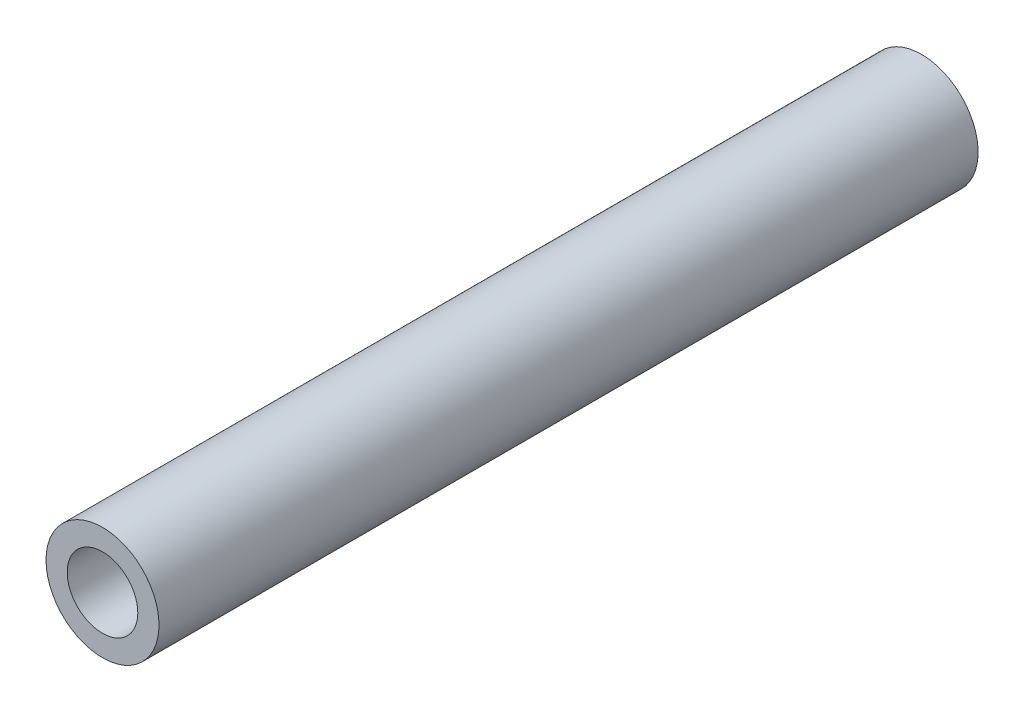
ISO-10303-21;
HEADER;
FILE_DESCRIPTION(('STEP AP214'),'2;1');
FILE_NAME('part.step','',(''),(''),'','','');
FILE_SCHEMA(('AUTOMOTIVE_DESIGN { 1 0 10303 214 1 1 1 1 }'));
ENDSEC;
DATA;
#1=APPLICATION_CONTEXT('core data for automotive mechanical design processes');
#2=APPLICATION_PROTOCOL_DEFINITION('international standard','automotive_design',2000,#1);
#3=PRODUCT_CONTEXT('',#1,'mechanical');
#4=PRODUCT('Part','Part','',(#3));
#5=PRODUCT_RELATED_PRODUCT_CATEGORY('part','',(#4));
#6=PRODUCT_DEFINITION_FORMATION('','',#4);
#7=PRODUCT_DEFINITION_CONTEXT('part definition',#1,'design');
#8=PRODUCT_DEFINITION('design','',#6,#7);
#9=PRODUCT_DEFINITION_SHAPE('','',#8);
#10=(LENGTH_UNIT() NAMED_UNIT(*) SI_UNIT(.MILLI.,.METRE.));
#11=(NAMED_UNIT(*) PLANE_ANGLE_UNIT() SI_UNIT($,.RADIAN.));
#12=(NAMED_UNIT(*) SI_UNIT($,.STERADIAN.) SOLID_ANGLE_UNIT());
#13=UNCERTAINTY_MEASURE_WITH_UNIT(LENGTH_MEASURE(1.E-05),#10,'distance_accuracy_value','');
#14=(GEOMETRIC_REPRESENTATION_CONTEXT(3) GLOBAL_UNCERTAINTY_ASSIGNED_CONTEXT((#13)) GLOBAL_UNIT_ASSIGNED_CONTEXT((#10,
#11,#12)) REPRESENTATION_CONTEXT('',''));
#15=CARTESIAN_POINT('',(0.,0.,0.));
#16=DIRECTION('',(0.,0.,1.));
#17=DIRECTION('',(1.,0.,0.));
#18=AXIS2_PLACEMENT_3D('',#15,#16,#17);
#19=CARTESIAN_POINT('',(0.,0.,29.));
#20=DIRECTION('',(0.,0.,-1.));
#21=DIRECTION('',(-1.,0.,0.));
#22=AXIS2_PLACEMENT_3D('',#19,#20,#21);
#23=CYLINDRICAL_SURFACE('',#22,2.);
#24=CARTESIAN_POINT('',(0.,0.,29.));
#25=DIRECTION('',(0.,0.,1.));
#26=DIRECTION('',(1.,0.,0.));
#27=AXIS2_PLACEMENT_3D('',#24,#25,#26);
#28=CIRCLE('',#27,2.);
#29=CARTESIAN_POINT('',(-2.,0.,29.));
#30=VERTEX_POINT('',#29);
#31=EDGE_CURVE('E11',#30,#30,#28,.T.);
#32=CARTESIAN_POINT('',(0.,0.,0.));
#33=DIRECTION('',(0.,0.,1.));
#34=DIRECTION('',(1.,0.,0.));
#35=AXIS2_PLACEMENT_3D('',#32,#33,#34);
#36=CIRCLE('',#35,2.);
#37=CARTESIAN_POINT('',(-2.,0.,0.));
#38=VERTEX_POINT('',#37);
#39=EDGE_CURVE('E36',#38,#38,#36,.T.);
#40=CARTESIAN_POINT('',(-2.,0.,29.));
#41=CARTESIAN_POINT('',(-2.,0.,28.6979166666667));
#42=CARTESIAN_POINT('',(-2.,0.,28.3958333333333));
#43=CARTESIAN_POINT('',(-2.,0.,27.7916666666667));
#44=CARTESIAN_POINT('',(-2.,0.,27.4895833333333));
#45=CARTESIAN_POINT('',(-2.,0.,26.8854166666667));
#46=CARTESIAN_POINT('',(-2.,0.,26.5833333333333));
#47=CARTESIAN_POINT('',(-2.,0.,25.9791666666667));
#48=CARTESIAN_POINT('',(-2.,0.,25.6770833333333));
#49=CARTESIAN_POINT('',(-2.,0.,25.0729166666667));
#50=CARTESIAN_POINT('',(-2.,0.,24.7708333333333));
#51=CARTESIAN_POINT('',(-2.,0.,24.1666666666667));
#52=CARTESIAN_POINT('',(-2.,0.,23.8645833333333));
#53=CARTESIAN_POINT('',(-2.,0.,23.2604166666667));
#54=CARTESIAN_POINT('',(-2.,0.,22.9583333333333));
#55=CARTESIAN_POINT('',(-2.,0.,22.3541666666667));
#56=CARTESIAN_POINT('',(-2.,0.,22.0520833333333));
#57=CARTESIAN_POINT('',(-2.,0.,21.4479166666667));
#58=CARTESIAN_POINT('',(-2.,0.,21.1458333333333));
#59=CARTESIAN_POINT('',(-2.,0.,20.5416666666667));
#60=CARTESIAN_POINT('',(-2.,0.,20.2395833333333));
#61=CARTESIAN_POINT('',(-2.,0.,19.6354166666667));
#62=CARTESIAN_POINT('',(-2.,0.,19.3333333333333));
#63=CARTESIAN_POINT('',(-2.,0.,18.7291666666667));
#64=CARTESIAN_POINT('',(-2.,0.,18.4270833333333));
#65=CARTESIAN_POINT('',(-2.,0.,17.8229166666667));
#66=CARTESIAN_POINT('',(-2.,0.,17.5208333333333));
#67=CARTESIAN_POINT('',(-2.,0.,16.9166666666667));
#68=CARTESIAN_POINT('',(-2.,0.,16.6145833333333));
#69=CARTESIAN_POINT('',(-2.,0.,16.0104166666667));
#70=CARTESIAN_POINT('',(-2.,0.,15.7083333333333));
#71=CARTESIAN_POINT('',(-2.,0.,15.1041666666667));
#72=CARTESIAN_POINT('',(-2.,0.,14.8020833333333));
#73=CARTESIAN_POINT('',(-2.,0.,14.1979166666667));
#74=CARTESIAN_POINT('',(-2.,0.,13.8958333333333));
#75=CARTESIAN_POINT('',(-2.,0.,13.2916666666667));
#76=CARTESIAN_POINT('',(-2.,0.,12.9895833333333));
#77=CARTESIAN_POINT('',(-2.,0.,12.3854166666667));
#78=CARTESIAN_POINT('',(-2.,0.,12.0833333333333));
#79=CARTESIAN_POINT('',(-2.,0.,11.4791666666667));
#80=CARTESIAN_POINT('',(-2.,0.,11.1770833333333));
#81=CARTESIAN_POINT('',(-2.,0.,10.5729166666667));
#82=CARTESIAN_POINT('',(-2.,0.,10.2708333333333));
#83=CARTESIAN_POINT('',(-2.,0.,9.66666666666667));
#84=CARTESIAN_POINT('',(-2.,0.,9.36458333333333));
#85=CARTESIAN_POINT('',(-2.,0.,8.76041666666667));
#86=CARTESIAN_POINT('',(-2.,0.,8.45833333333333));
#87=CARTESIAN_POINT('',(-2.,0.,7.85416666666667));
#88=CARTESIAN_POINT('',(-2.,0.,7.55208333333333));
#89=CARTESIAN_POINT('',(-2.,0.,6.94791666666667));
#90=CARTESIAN_POINT('',(-2.,0.,6.64583333333333));
#91=CARTESIAN_POINT('',(-2.,0.,6.04166666666667));
#92=CARTESIAN_POINT('',(-2.,0.,5.73958333333333));
#93=CARTESIAN_POINT('',(-2.,0.,5.13541666666667));
#94=CARTESIAN_POINT('',(-2.,0.,4.83333333333333));
#95=CARTESIAN_POINT('',(-2.,0.,4.22916666666667));
#96=CARTESIAN_POINT('',(-2.,0.,3.92708333333333));
#97=CARTESIAN_POINT('',(-2.,0.,3.32291666666667));
#98=CARTESIAN_POINT('',(-2.,0.,3.02083333333333));
#99=CARTESIAN_POINT('',(-2.,0.,2.41666666666667));
#100=CARTESIAN_POINT('',(-2.,0.,2.11458333333333));
#101=CARTESIAN_POINT('',(-2.,0.,1.51041666666667));
#102=CARTESIAN_POINT('',(-2.,0.,1.20833333333333));
#103=CARTESIAN_POINT('',(-2.,0.,0.604166666666667));
#104=CARTESIAN_POINT('',(-2.,0.,0.302083333333333));
#105=CARTESIAN_POINT('',(-2.,0.,0.));
#106=B_SPLINE_CURVE_WITH_KNOTS('',3,(#40,#41,#42,#43,#44,#45,#46,#47,#48,#49,#50,#51,#52,#53,
#54,#55,#56,#57,#58,#59,#60,#61,#62,#63,#64,#65,#66,#67,#68,#69,#70,#71,#72,#73,#74,#75,#76,#77,
#78,#79,#80,#81,#82,#83,#84,#85,#86,#87,#88,#89,#90,#91,#92,#93,#94,#95,#96,#97,#98,#99,#100,
#101,#102,#103,#104,#105),.UNSPECIFIED.,.F.,.F.,(4,2,2,2,2,2,2,2,2,2,2,2,2,2,2,2,2,2,2,2,2,2,2,
2,2,2,2,2,2,2,2,2,4),(0.,0.906249999999997,1.8125,2.71875,3.625,4.53125,5.4375,6.34375,7.25,
8.15625,9.0625,9.96875,10.875,11.78125,12.6875,13.59375,14.5,15.40625,16.3125,17.21875,18.125,
19.03125,19.9375,20.84375,21.75,22.65625,23.5625,24.46875,25.375,26.28125,27.1875,28.09375,29.),.UNSPECIFIED.);
#107=EDGE_CURVE('BSEAM33',#30,#38,#106,.T.);
#108=ORIENTED_EDGE('',*,*,#31,.F.);
#109=ORIENTED_EDGE('',*,*,#39,.T.);
#110=ORIENTED_EDGE('',*,*,#107,.T.);
#111=ORIENTED_EDGE('',*,*,#107,.F.);
#112=EDGE_LOOP('',(#108,#110,#109,#111));
#113=FACE_BOUND('',#112,.T.);
#114=ADVANCED_FACE('F33',(#113),#23,.T.);
#115=CARTESIAN_POINT('',(0.,0.,29.));
#116=DIRECTION('',(0.,0.,1.));
#117=DIRECTION('',(1.,0.,0.));
#118=AXIS2_PLACEMENT_3D('',#115,#116,#117);
#119=PLANE('',#118);
#120=CARTESIAN_POINT('',(0.,0.,29.));
#121=DIRECTION('',(0.,0.,1.));
#122=DIRECTION('',(1.,0.,0.));
#123=AXIS2_PLACEMENT_3D('',#120,#121,#122);
#124=CIRCLE('',#123,1.25);
#125=CARTESIAN_POINT('',(1.25,0.,29.));
#126=VERTEX_POINT('',#125);
#127=EDGE_CURVE('E56',#126,#126,#124,.T.);
#128=ORIENTED_EDGE('',*,*,#127,.F.);
#129=EDGE_LOOP('',(#128));
#130=FACE_BOUND('',#129,.T.);
#131=ORIENTED_EDGE('',*,*,#31,.T.);
#132=EDGE_LOOP('',(#131));
#133=FACE_BOUND('',#132,.T.);
#134=ADVANCED_FACE('F75',(#130,#133),#119,.T.);
#135=CARTESIAN_POINT('',(0.,0.,0.));
#136=DIRECTION('',(0.,0.,1.));
#137=DIRECTION('',(1.,0.,0.));
#138=AXIS2_PLACEMENT_3D('',#135,#136,#137);
#139=PLANE('',#138);
#140=CARTESIAN_POINT('',(0.,0.,0.));
#141=DIRECTION('',(0.,0.,-1.));
#142=DIRECTION('',(-1.,0.,0.));
#143=AXIS2_PLACEMENT_3D('',#140,#141,#142);
#144=CIRCLE('',#143,1.25);
#145=CARTESIAN_POINT('',(-1.25,0.,0.));
#146=VERTEX_POINT('',#145);
#147=EDGE_CURVE('E57',#146,#146,#144,.T.);
#148=ORIENTED_EDGE('',*,*,#147,.F.);
#149=EDGE_LOOP('',(#148));
#150=FACE_BOUND('',#149,.T.);
#151=ORIENTED_EDGE('',*,*,#39,.F.);
#152=EDGE_LOOP('',(#151));
#153=FACE_BOUND('',#152,.T.);
#154=ADVANCED_FACE('F72',(#150,#153),#139,.F.);
#155=CARTESIAN_POINT('',(0.,0.,24.));
#156=DIRECTION('',(0.,0.,1.));
#157=DIRECTION('',(1.,0.,0.));
#158=AXIS2_PLACEMENT_3D('',#155,#156,#157);
#159=CONICAL_SURFACE('',#158,1.25,1.02974425867665);
#160=CARTESIAN_POINT('',(0.,0.,23.2489242262155));
#161=VERTEX_POINT('',#160);
#162=VERTEX_LOOP('',#161);
#163=FACE_BOUND('',#162,.T.);
#164=CARTESIAN_POINT('',(0.,0.,24.));
#165=DIRECTION('',(0.,0.,1.));
#166=DIRECTION('',(1.,0.,0.));
#167=AXIS2_PLACEMENT_3D('',#164,#165,#166);
#168=CIRCLE('',#167,1.25);
#169=CARTESIAN_POINT('',(1.25,0.,24.));
#170=VERTEX_POINT('',#169);
#171=EDGE_CURVE('E60',#170,#170,#168,.T.);
#172=ORIENTED_EDGE('',*,*,#171,.T.);
#173=EDGE_LOOP('',(#172));
#174=FACE_BOUND('',#173,.T.);
#175=ADVANCED_FACE('F74',(#163,#174),#159,.F.);
#176=CARTESIAN_POINT('',(0.,0.,29.));
#177=DIRECTION('',(0.,0.,1.));
#178=DIRECTION('',(1.,0.,0.));
#179=AXIS2_PLACEMENT_3D('',#176,#177,#178);
#180=CYLINDRICAL_SURFACE('',#179,1.25);
#181=ORIENTED_EDGE('',*,*,#171,.F.);
#182=EDGE_LOOP('',(#181));
#183=FACE_BOUND('',#182,.T.);
#184=ORIENTED_EDGE('',*,*,#127,.T.);
#185=EDGE_LOOP('',(#184));
#186=FACE_BOUND('',#185,.T.);
#187=ADVANCED_FACE('F50',(#183,#186),#180,.F.);
#188=CARTESIAN_POINT('',(0.,0.,5.));
#189=DIRECTION('',(0.,0.,-1.));
#190=DIRECTION('',(-1.,0.,0.));
#191=AXIS2_PLACEMENT_3D('',#188,#189,#190);
#192=CONICAL_SURFACE('',#191,1.25,1.02974425867665);
#193=CARTESIAN_POINT('',(0.,0.,5.75107577378445));
#194=VERTEX_POINT('',#193);
#195=VERTEX_LOOP('',#194);
#196=FACE_BOUND('',#195,.T.);
#197=CARTESIAN_POINT('',(0.,0.,5.));
#198=DIRECTION('',(0.,0.,-1.));
#199=DIRECTION('',(-1.,0.,0.));
#200=AXIS2_PLACEMENT_3D('',#197,#198,#199);
#201=CIRCLE('',#200,1.25);
#202=CARTESIAN_POINT('',(-1.25,0.,5.));
#203=VERTEX_POINT('',#202);
#204=EDGE_CURVE('E54',#203,#203,#201,.T.);
#205=ORIENTED_EDGE('',*,*,#204,.T.);
#206=EDGE_LOOP('',(#205));
#207=FACE_BOUND('',#206,.T.);
#208=ADVANCED_FACE('F46',(#196,#207),#192,.F.);
#209=CARTESIAN_POINT('',(0.,0.,0.));
#210=DIRECTION('',(0.,0.,-1.));
#211=DIRECTION('',(-1.,0.,0.));
#212=AXIS2_PLACEMENT_3D('',#209,#210,#211);
#213=CYLINDRICAL_SURFACE('',#212,1.25);
#214=ORIENTED_EDGE('',*,*,#204,.F.);
#215=EDGE_LOOP('',(#214));
#216=FACE_BOUND('',#215,.T.);
#217=ORIENTED_EDGE('',*,*,#147,.T.);
#218=EDGE_LOOP('',(#217));
#219=FACE_BOUND('',#218,.T.);
#220=ADVANCED_FACE('F49',(#216,#219),#213,.F.);
#221=CLOSED_SHELL('',(#114,#134,#154,#175,#187,#208,#220));
#222=MANIFOLD_SOLID_BREP('B2',#221);
#223=ADVANCED_BREP_SHAPE_REPRESENTATION('',(#18,#222),#14);
#224=SHAPE_DEFINITION_REPRESENTATION(#9,#223);
ENDSEC;
END-ISO-10303-21;
